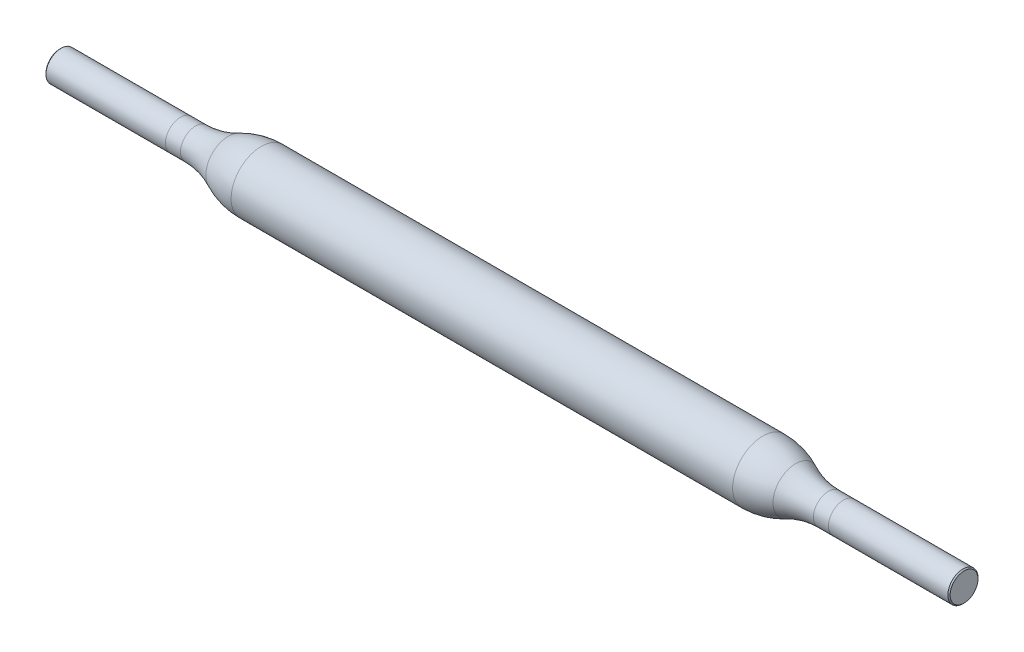
ISO-10303-21;
HEADER;
FILE_DESCRIPTION(('STEP AP214'),'2;1');
FILE_NAME('part.step','',(''),(''),'','','');
FILE_SCHEMA(('AUTOMOTIVE_DESIGN { 1 0 10303 214 1 1 1 1 }'));
ENDSEC;
DATA;
#1=APPLICATION_CONTEXT('core data for automotive mechanical design processes');
#2=APPLICATION_PROTOCOL_DEFINITION('international standard','automotive_design',2000,#1);
#3=PRODUCT_CONTEXT('',#1,'mechanical');
#4=PRODUCT('Part','Part','',(#3));
#5=PRODUCT_RELATED_PRODUCT_CATEGORY('part','',(#4));
#6=PRODUCT_DEFINITION_FORMATION('','',#4);
#7=PRODUCT_DEFINITION_CONTEXT('part definition',#1,'design');
#8=PRODUCT_DEFINITION('design','',#6,#7);
#9=PRODUCT_DEFINITION_SHAPE('','',#8);
#10=(LENGTH_UNIT() NAMED_UNIT(*) SI_UNIT(.MILLI.,.METRE.));
#11=(NAMED_UNIT(*) PLANE_ANGLE_UNIT() SI_UNIT($,.RADIAN.));
#12=(NAMED_UNIT(*) SI_UNIT($,.STERADIAN.) SOLID_ANGLE_UNIT());
#13=UNCERTAINTY_MEASURE_WITH_UNIT(LENGTH_MEASURE(1.E-05),#10,'distance_accuracy_value','');
#14=(GEOMETRIC_REPRESENTATION_CONTEXT(3) GLOBAL_UNCERTAINTY_ASSIGNED_CONTEXT((#13)) GLOBAL_UNIT_ASSIGNED_CONTEXT((#10,
#11,#12)) REPRESENTATION_CONTEXT('',''));
#15=CARTESIAN_POINT('',(0.,0.,0.));
#16=DIRECTION('',(0.,0.,1.));
#17=DIRECTION('',(1.,0.,0.));
#18=AXIS2_PLACEMENT_3D('',#15,#16,#17);
#19=CARTESIAN_POINT('',(-30.,0.,0.));
#20=DIRECTION('',(-1.,0.,0.));
#21=DIRECTION('',(0.,-1.,0.));
#22=AXIS2_PLACEMENT_3D('',#19,#20,#21);
#23=CYLINDRICAL_SURFACE('',#22,1.00000000000001);
#24=CARTESIAN_POINT('',(21.,0.,0.));
#25=DIRECTION('',(-1.,0.,0.));
#26=DIRECTION('',(0.,-1.,0.));
#27=AXIS2_PLACEMENT_3D('',#24,#25,#26);
#28=CIRCLE('',#27,1.);
#29=CARTESIAN_POINT('',(21.,-1.,0.));
#30=VERTEX_POINT('',#29);
#31=EDGE_CURVE('E64',#30,#30,#28,.T.);
#32=ORIENTED_EDGE('',*,*,#31,.F.);
#33=EDGE_LOOP('',(#32));
#34=FACE_BOUND('',#33,.T.);
#35=CARTESIAN_POINT('',(22.,0.,0.));
#36=DIRECTION('',(1.,0.,0.));
#37=DIRECTION('',(0.,0.,-1.));
#38=AXIS2_PLACEMENT_3D('',#35,#36,#37);
#39=CIRCLE('',#38,1.00000000000001);
#40=CARTESIAN_POINT('',(22.,0.,-1.00000000000001));
#41=VERTEX_POINT('',#40);
#42=EDGE_CURVE('E56',#41,#41,#39,.T.);
#43=ORIENTED_EDGE('',*,*,#42,.F.);
#44=EDGE_LOOP('',(#43));
#45=FACE_BOUND('',#44,.T.);
#46=ADVANCED_FACE('F35',(#34,#45),#23,.T.);
#47=CARTESIAN_POINT('',(-30.,0.,0.));
#48=DIRECTION('',(-1.,0.,0.));
#49=DIRECTION('',(0.,-1.,0.));
#50=AXIS2_PLACEMENT_3D('',#47,#48,#49);
#51=CYLINDRICAL_SURFACE('',#50,1.00000000000001);
#52=CARTESIAN_POINT('',(-29.925,0.,0.));
#53=DIRECTION('',(1.,0.,0.));
#54=DIRECTION('',(0.,1.,0.));
#55=AXIS2_PLACEMENT_3D('',#52,#53,#54);
#56=CIRCLE('',#55,1.00000000000001);
#57=CARTESIAN_POINT('',(-29.925,0.999999999999997,0.));
#58=VERTEX_POINT('',#57);
#59=EDGE_CURVE('E47',#58,#58,#56,.T.);
#60=ORIENTED_EDGE('',*,*,#59,.T.);
#61=EDGE_LOOP('',(#60));
#62=FACE_BOUND('',#61,.T.);
#63=CARTESIAN_POINT('',(-22.,0.,0.));
#64=DIRECTION('',(1.,0.,0.));
#65=DIRECTION('',(0.,0.,-1.));
#66=AXIS2_PLACEMENT_3D('',#63,#64,#65);
#67=CIRCLE('',#66,1.00000000000001);
#68=CARTESIAN_POINT('',(-22.,0.,-1.00000000000001));
#69=VERTEX_POINT('',#68);
#70=EDGE_CURVE('E60',#69,#69,#67,.T.);
#71=ORIENTED_EDGE('',*,*,#70,.F.);
#72=EDGE_LOOP('',(#71));
#73=FACE_BOUND('',#72,.T.);
#74=ADVANCED_FACE('F118',(#62,#73),#51,.T.);
#75=CARTESIAN_POINT('',(-30.,0.,0.));
#76=DIRECTION('',(1.,0.,0.));
#77=DIRECTION('',(0.,1.,0.));
#78=AXIS2_PLACEMENT_3D('',#75,#76,#77);
#79=PLANE('',#78);
#80=CARTESIAN_POINT('',(-30.,0.,0.));
#81=DIRECTION('',(1.,0.,0.));
#82=DIRECTION('',(0.,1.,0.));
#83=AXIS2_PLACEMENT_3D('',#80,#81,#82);
#84=CIRCLE('',#83,0.925000000000009);
#85=CARTESIAN_POINT('',(-30.,0.924999999999998,0.));
#86=VERTEX_POINT('',#85);
#87=EDGE_CURVE('E51',#86,#86,#84,.F.);
#88=ORIENTED_EDGE('',*,*,#87,.T.);
#89=EDGE_LOOP('',(#88));
#90=FACE_BOUND('',#89,.T.);
#91=ADVANCED_FACE('F127',(#90),#79,.F.);
#92=CARTESIAN_POINT('',(30.,0.,0.));
#93=DIRECTION('',(-1.,0.,0.));
#94=DIRECTION('',(0.,-1.,0.));
#95=AXIS2_PLACEMENT_3D('',#92,#93,#94);
#96=PLANE('',#95);
#97=CARTESIAN_POINT('',(30.,0.,0.));
#98=DIRECTION('',(-1.,0.,0.));
#99=DIRECTION('',(0.,-1.,0.));
#100=AXIS2_PLACEMENT_3D('',#97,#98,#99);
#101=CIRCLE('',#100,0.925000000000009);
#102=CARTESIAN_POINT('',(30.,-0.925000000000009,0.));
#103=VERTEX_POINT('',#102);
#104=EDGE_CURVE('E10',#103,#103,#101,.F.);
#105=ORIENTED_EDGE('',*,*,#104,.T.);
#106=EDGE_LOOP('',(#105));
#107=FACE_BOUND('',#106,.T.);
#108=ADVANCED_FACE('F123',(#107),#96,.F.);
#109=CARTESIAN_POINT('',(29.925,0.,0.));
#110=DIRECTION('',(-1.,0.,0.));
#111=DIRECTION('',(0.,-1.,0.));
#112=AXIS2_PLACEMENT_3D('',#109,#110,#111);
#113=CIRCLE('',#112,1.00000000000001);
#114=CARTESIAN_POINT('',(29.925,-1.00000000000001,0.));
#115=VERTEX_POINT('',#114);
#116=EDGE_CURVE('E43',#115,#115,#113,.T.);
#117=ORIENTED_EDGE('',*,*,#116,.T.);
#118=EDGE_LOOP('',(#117));
#119=FACE_BOUND('',#118,.T.);
#120=ORIENTED_EDGE('',*,*,#42,.T.);
#121=EDGE_LOOP('',(#120));
#122=FACE_BOUND('',#121,.T.);
#123=ADVANCED_FACE('F112',(#119,#122),#23,.T.);
#124=CARTESIAN_POINT('',(21.,0.,0.));
#125=DIRECTION('',(-1.,0.,0.));
#126=DIRECTION('',(0.,-1.,0.));
#127=AXIS2_PLACEMENT_3D('',#124,#125,#126);
#128=TOROIDAL_SURFACE('',#127,6.,5.);
#129=CARTESIAN_POINT('',(18.8205505282297,0.,0.));
#130=DIRECTION('',(-1.,0.,0.));
#131=DIRECTION('',(0.,-1.,0.));
#132=AXIS2_PLACEMENT_3D('',#129,#130,#131);
#133=CIRCLE('',#132,1.5);
#134=CARTESIAN_POINT('',(18.8205505282297,-1.5,0.));
#135=VERTEX_POINT('',#134);
#136=EDGE_CURVE('E67',#135,#135,#133,.T.);
#137=ORIENTED_EDGE('',*,*,#136,.F.);
#138=EDGE_LOOP('',(#137));
#139=FACE_BOUND('',#138,.T.);
#140=ORIENTED_EDGE('',*,*,#31,.T.);
#141=EDGE_LOOP('',(#140));
#142=FACE_BOUND('',#141,.T.);
#143=ADVANCED_FACE('F106',(#139,#142),#128,.F.);
#144=CARTESIAN_POINT('',(16.6411010564593,0.,0.));
#145=DIRECTION('',(-1.,0.,0.));
#146=DIRECTION('',(0.,-1.,0.));
#147=AXIS2_PLACEMENT_3D('',#144,#145,#146);
#148=DEGENERATE_TOROIDAL_SURFACE('',#147,3.00000000000001,5.,.F.);
#149=CARTESIAN_POINT('',(16.6411010564593,0.,0.));
#150=DIRECTION('',(-1.,0.,0.));
#151=DIRECTION('',(0.,-1.,0.));
#152=AXIS2_PLACEMENT_3D('',#149,#150,#151);
#153=CIRCLE('',#152,1.99999999999999);
#154=CARTESIAN_POINT('',(16.6411010564593,-1.99999999999999,0.));
#155=VERTEX_POINT('',#154);
#156=EDGE_CURVE('E70',#155,#155,#153,.T.);
#157=ORIENTED_EDGE('',*,*,#156,.F.);
#158=EDGE_LOOP('',(#157));
#159=FACE_BOUND('',#158,.T.);
#160=ORIENTED_EDGE('',*,*,#136,.T.);
#161=EDGE_LOOP('',(#160));
#162=FACE_BOUND('',#161,.T.);
#163=ADVANCED_FACE('F100',(#159,#162),#148,.F.);
#164=CARTESIAN_POINT('',(-30.,0.,0.));
#165=DIRECTION('',(-1.,0.,0.));
#166=DIRECTION('',(0.,-1.,0.));
#167=AXIS2_PLACEMENT_3D('',#164,#165,#166);
#168=CYLINDRICAL_SURFACE('',#167,2.);
#169=CARTESIAN_POINT('',(-16.6411010564593,0.,0.));
#170=DIRECTION('',(-1.,0.,0.));
#171=DIRECTION('',(0.,-1.,0.));
#172=AXIS2_PLACEMENT_3D('',#169,#170,#171);
#173=CIRCLE('',#172,2.);
#174=CARTESIAN_POINT('',(-16.6411010564593,-2.00000000000001,0.));
#175=VERTEX_POINT('',#174);
#176=EDGE_CURVE('E73',#175,#175,#173,.T.);
#177=ORIENTED_EDGE('',*,*,#176,.F.);
#178=EDGE_LOOP('',(#177));
#179=FACE_BOUND('',#178,.T.);
#180=ORIENTED_EDGE('',*,*,#156,.T.);
#181=EDGE_LOOP('',(#180));
#182=FACE_BOUND('',#181,.T.);
#183=ADVANCED_FACE('F94',(#179,#182),#168,.T.);
#184=CARTESIAN_POINT('',(-16.6411010564593,0.,0.));
#185=DIRECTION('',(-1.,0.,0.));
#186=DIRECTION('',(0.,-1.,0.));
#187=AXIS2_PLACEMENT_3D('',#184,#185,#186);
#188=DEGENERATE_TOROIDAL_SURFACE('',#187,3.,5.,.F.);
#189=CARTESIAN_POINT('',(-18.8205505282297,0.,0.));
#190=DIRECTION('',(-1.,0.,0.));
#191=DIRECTION('',(0.,-1.,0.));
#192=AXIS2_PLACEMENT_3D('',#189,#190,#191);
#193=CIRCLE('',#192,1.5);
#194=CARTESIAN_POINT('',(-18.8205505282297,-1.50000000000001,0.));
#195=VERTEX_POINT('',#194);
#196=EDGE_CURVE('E76',#195,#195,#193,.T.);
#197=ORIENTED_EDGE('',*,*,#196,.F.);
#198=EDGE_LOOP('',(#197));
#199=FACE_BOUND('',#198,.T.);
#200=ORIENTED_EDGE('',*,*,#176,.T.);
#201=EDGE_LOOP('',(#200));
#202=FACE_BOUND('',#201,.T.);
#203=ADVANCED_FACE('F88',(#199,#202),#188,.F.);
#204=CARTESIAN_POINT('',(-21.,0.,0.));
#205=DIRECTION('',(-1.,0.,0.));
#206=DIRECTION('',(0.,-1.,0.));
#207=AXIS2_PLACEMENT_3D('',#204,#205,#206);
#208=TOROIDAL_SURFACE('',#207,6.,4.99999999999999);
#209=CARTESIAN_POINT('',(-21.,0.,0.));
#210=DIRECTION('',(-1.,0.,0.));
#211=DIRECTION('',(0.,-1.,0.));
#212=AXIS2_PLACEMENT_3D('',#209,#210,#211);
#213=CIRCLE('',#212,1.);
#214=CARTESIAN_POINT('',(-21.,-1.00000000000001,0.));
#215=VERTEX_POINT('',#214);
#216=EDGE_CURVE('E79',#215,#215,#213,.T.);
#217=ORIENTED_EDGE('',*,*,#216,.F.);
#218=EDGE_LOOP('',(#217));
#219=FACE_BOUND('',#218,.T.);
#220=ORIENTED_EDGE('',*,*,#196,.T.);
#221=EDGE_LOOP('',(#220));
#222=FACE_BOUND('',#221,.T.);
#223=ADVANCED_FACE('F85',(#219,#222),#208,.F.);
#224=ORIENTED_EDGE('',*,*,#70,.T.);
#225=EDGE_LOOP('',(#224));
#226=FACE_BOUND('',#225,.T.);
#227=ORIENTED_EDGE('',*,*,#216,.T.);
#228=EDGE_LOOP('',(#227));
#229=FACE_BOUND('',#228,.T.);
#230=ADVANCED_FACE('F83',(#226,#229),#51,.T.);
#231=CARTESIAN_POINT('',(-30.,0.,0.));
#232=DIRECTION('',(1.,0.,0.));
#233=DIRECTION('',(0.,1.,0.));
#234=AXIS2_PLACEMENT_3D('',#231,#232,#233);
#235=CONICAL_SURFACE('',#234,0.925000000000009,0.78539816339747);
#236=ORIENTED_EDGE('',*,*,#59,.F.);
#237=EDGE_LOOP('',(#236));
#238=FACE_BOUND('',#237,.T.);
#239=ORIENTED_EDGE('',*,*,#87,.F.);
#240=EDGE_LOOP('',(#239));
#241=FACE_BOUND('',#240,.T.);
#242=ADVANCED_FACE('F133',(#238,#241),#235,.T.);
#243=CARTESIAN_POINT('',(29.925,0.,0.));
#244=DIRECTION('',(-1.,0.,0.));
#245=DIRECTION('',(0.,-1.,0.));
#246=AXIS2_PLACEMENT_3D('',#243,#244,#245);
#247=CONICAL_SURFACE('',#246,1.00000000000001,0.785398163397392);
#248=ORIENTED_EDGE('',*,*,#104,.F.);
#249=EDGE_LOOP('',(#248));
#250=FACE_BOUND('',#249,.T.);
#251=ORIENTED_EDGE('',*,*,#116,.F.);
#252=EDGE_LOOP('',(#251));
#253=FACE_BOUND('',#252,.T.);
#254=ADVANCED_FACE('F38',(#250,#253),#247,.T.);
#255=CLOSED_SHELL('',(#46,#74,#91,#108,#123,#143,#163,#183,#203,#223,#230,#242,#254));
#256=MANIFOLD_SOLID_BREP('B2',#255);
#257=ADVANCED_BREP_SHAPE_REPRESENTATION('',(#18,#256),#14);
#258=SHAPE_DEFINITION_REPRESENTATION(#9,#257);
ENDSEC;
END-ISO-10303-21;
